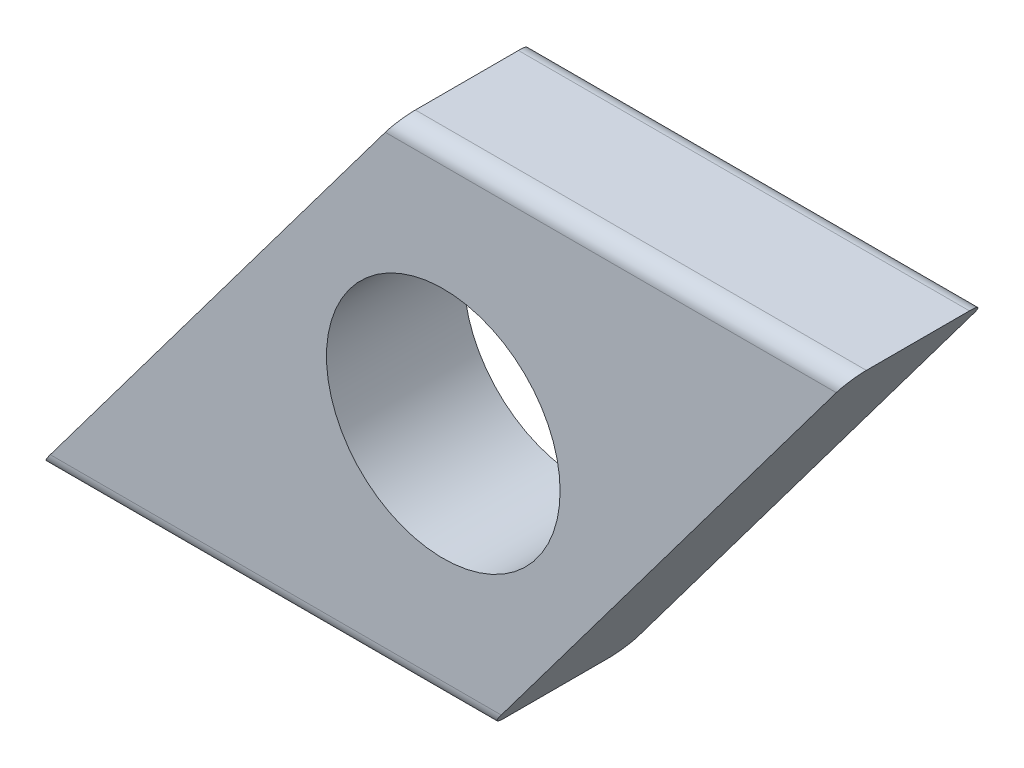
ISO-10303-21;
HEADER;
FILE_DESCRIPTION(('STEP AP214'),'2;1');
FILE_NAME('part.step','',(''),(''),'','','');
FILE_SCHEMA(('AUTOMOTIVE_DESIGN { 1 0 10303 214 1 1 1 1 }'));
ENDSEC;
DATA;
#1=APPLICATION_CONTEXT('core data for automotive mechanical design processes');
#2=APPLICATION_PROTOCOL_DEFINITION('international standard','automotive_design',2000,#1);
#3=PRODUCT_CONTEXT('',#1,'mechanical');
#4=PRODUCT('Part','Part','',(#3));
#5=PRODUCT_RELATED_PRODUCT_CATEGORY('part','',(#4));
#6=PRODUCT_DEFINITION_FORMATION('','',#4);
#7=PRODUCT_DEFINITION_CONTEXT('part definition',#1,'design');
#8=PRODUCT_DEFINITION('design','',#6,#7);
#9=PRODUCT_DEFINITION_SHAPE('','',#8);
#10=(LENGTH_UNIT() NAMED_UNIT(*) SI_UNIT(.MILLI.,.METRE.));
#11=(NAMED_UNIT(*) PLANE_ANGLE_UNIT() SI_UNIT($,.RADIAN.));
#12=(NAMED_UNIT(*) SI_UNIT($,.STERADIAN.) SOLID_ANGLE_UNIT());
#13=UNCERTAINTY_MEASURE_WITH_UNIT(LENGTH_MEASURE(1.E-05),#10,'distance_accuracy_value','');
#14=(GEOMETRIC_REPRESENTATION_CONTEXT(3) GLOBAL_UNCERTAINTY_ASSIGNED_CONTEXT((#13)) GLOBAL_UNIT_ASSIGNED_CONTEXT((#10,
#11,#12)) REPRESENTATION_CONTEXT('',''));
#15=CARTESIAN_POINT('',(0.,0.,0.));
#16=DIRECTION('',(0.,0.,1.));
#17=DIRECTION('',(1.,0.,0.));
#18=AXIS2_PLACEMENT_3D('',#15,#16,#17);
#19=CARTESIAN_POINT('',(23.6250000000003,14.,4.));
#20=DIRECTION('',(0.,-1.,0.));
#21=DIRECTION('',(0.,0.,-1.));
#22=AXIS2_PLACEMENT_3D('',#19,#20,#21);
#23=PLANE('',#22);
#24=DIRECTION('',(0.,0.,-1.));
#25=VECTOR('',#24,1.);
#26=CARTESIAN_POINT('',(23.6250000000003,14.,4.));
#27=LINE('',#26,#25);
#28=CARTESIAN_POINT('',(23.6250000000003,14.,3.5));
#29=VERTEX_POINT('',#28);
#30=CARTESIAN_POINT('',(23.6250000000003,14.,0.5));
#31=VERTEX_POINT('',#30);
#32=EDGE_CURVE('E166',#29,#31,#27,.T.);
#33=ORIENTED_EDGE('',*,*,#32,.T.);
#34=DIRECTION('',(-1.,0.,0.));
#35=VECTOR('',#34,1.);
#36=CARTESIAN_POINT('',(23.6250000000003,14.,0.5));
#37=LINE('',#36,#35);
#38=CARTESIAN_POINT('',(10.5000000000001,14.,0.5));
#39=VERTEX_POINT('',#38);
#40=EDGE_CURVE('E122',#31,#39,#37,.T.);
#41=ORIENTED_EDGE('',*,*,#40,.T.);
#42=DIRECTION('',(0.,0.,-1.));
#43=VECTOR('',#42,1.);
#44=CARTESIAN_POINT('',(10.5000000000001,14.,4.));
#45=LINE('',#44,#43);
#46=CARTESIAN_POINT('',(10.5000000000001,14.,3.5));
#47=VERTEX_POINT('',#46);
#48=EDGE_CURVE('E106',#47,#39,#45,.T.);
#49=ORIENTED_EDGE('',*,*,#48,.F.);
#50=DIRECTION('',(-1.,0.,0.));
#51=VECTOR('',#50,1.);
#52=CARTESIAN_POINT('',(23.6250000000003,14.,3.5));
#53=LINE('',#52,#51);
#54=EDGE_CURVE('E119',#47,#29,#53,.F.);
#55=ORIENTED_EDGE('',*,*,#54,.T.);
#56=EDGE_LOOP('',(#33,#41,#49,#55));
#57=FACE_BOUND('',#56,.T.);
#58=ADVANCED_FACE('F37',(#57),#23,.F.);
#59=CARTESIAN_POINT('',(10.5000000000001,14.,4.));
#60=DIRECTION('',(0.8,-0.6,0.));
#61=DIRECTION('',(0.6,0.8,0.));
#62=AXIS2_PLACEMENT_3D('',#59,#60,#61);
#63=PLANE('',#62);
#64=ORIENTED_EDGE('',*,*,#48,.T.);
#65=CARTESIAN_POINT('',(10.1250000000001,13.5,0.5));
#66=DIRECTION('',(0.8,-0.6,0.));
#67=DIRECTION('',(-0.6,-0.8,0.));
#68=AXIS2_PLACEMENT_3D('',#65,#66,#67);
#69=ELLIPSE('',#68,0.625,0.5);
#70=CARTESIAN_POINT('',(10.1250000000001,13.5,0.));
#71=VERTEX_POINT('',#70);
#72=EDGE_CURVE('E113',#39,#71,#69,.F.);
#73=ORIENTED_EDGE('',*,*,#72,.T.);
#74=DIRECTION('',(-0.6,-0.8,0.));
#75=VECTOR('',#74,1.);
#76=CARTESIAN_POINT('',(10.5000000000001,14.,0.));
#77=LINE('',#76,#75);
#78=CARTESIAN_POINT('',(0.375000000000058,0.499999999999999,0.));
#79=VERTEX_POINT('',#78);
#80=EDGE_CURVE('E173',#71,#79,#77,.T.);
#81=ORIENTED_EDGE('',*,*,#80,.T.);
#82=CARTESIAN_POINT('',(0.375000000000059,0.5,0.5));
#83=DIRECTION('',(0.8,-0.6,0.));
#84=DIRECTION('',(0.6,0.8,0.));
#85=AXIS2_PLACEMENT_3D('',#82,#83,#84);
#86=ELLIPSE('',#85,0.625,0.5);
#87=CARTESIAN_POINT('',(0.,0.,0.5));
#88=VERTEX_POINT('',#87);
#89=EDGE_CURVE('E114',#79,#88,#86,.F.);
#90=ORIENTED_EDGE('',*,*,#89,.T.);
#91=DIRECTION('',(0.,0.,-1.));
#92=VECTOR('',#91,1.);
#93=CARTESIAN_POINT('',(0.,0.,4.));
#94=LINE('',#93,#92);
#95=CARTESIAN_POINT('',(0.,0.,3.5));
#96=VERTEX_POINT('',#95);
#97=EDGE_CURVE('E123',#96,#88,#94,.T.);
#98=ORIENTED_EDGE('',*,*,#97,.F.);
#99=CARTESIAN_POINT('',(0.375000000000058,0.5,3.5));
#100=DIRECTION('',(0.8,-0.6,0.));
#101=DIRECTION('',(-0.6,-0.8,0.));
#102=AXIS2_PLACEMENT_3D('',#99,#100,#101);
#103=ELLIPSE('',#102,0.625,0.5);
#104=CARTESIAN_POINT('',(0.375000000000058,0.499999999999999,4.));
#105=VERTEX_POINT('',#104);
#106=EDGE_CURVE('E129',#96,#105,#103,.F.);
#107=ORIENTED_EDGE('',*,*,#106,.T.);
#108=DIRECTION('',(-0.6,-0.8,0.));
#109=VECTOR('',#108,1.);
#110=CARTESIAN_POINT('',(10.5000000000001,14.,4.));
#111=LINE('',#110,#109);
#112=CARTESIAN_POINT('',(10.1250000000001,13.5,4.));
#113=VERTEX_POINT('',#112);
#114=EDGE_CURVE('E108',#113,#105,#111,.T.);
#115=ORIENTED_EDGE('',*,*,#114,.F.);
#116=CARTESIAN_POINT('',(10.1250000000001,13.5,3.5));
#117=DIRECTION('',(0.8,-0.6,0.));
#118=DIRECTION('',(0.6,0.8,0.));
#119=AXIS2_PLACEMENT_3D('',#116,#117,#118);
#120=ELLIPSE('',#119,0.625,0.5);
#121=EDGE_CURVE('E103',#113,#47,#120,.F.);
#122=ORIENTED_EDGE('',*,*,#121,.T.);
#123=EDGE_LOOP('',(#64,#73,#81,#90,#98,#107,#115,#122));
#124=FACE_BOUND('',#123,.T.);
#125=ADVANCED_FACE('F105',(#124),#63,.F.);
#126=CARTESIAN_POINT('',(0.,0.,4.));
#127=DIRECTION('',(0.,1.,0.));
#128=DIRECTION('',(0.,0.,1.));
#129=AXIS2_PLACEMENT_3D('',#126,#127,#128);
#130=PLANE('',#129);
#131=ORIENTED_EDGE('',*,*,#97,.T.);
#132=DIRECTION('',(1.,0.,0.));
#133=VECTOR('',#132,1.);
#134=CARTESIAN_POINT('',(0.,0.,0.5));
#135=LINE('',#134,#133);
#136=CARTESIAN_POINT('',(13.1249999999998,0.,0.5));
#137=VERTEX_POINT('',#136);
#138=EDGE_CURVE('E11',#88,#137,#135,.T.);
#139=ORIENTED_EDGE('',*,*,#138,.T.);
#140=DIRECTION('',(0.,0.,-1.));
#141=VECTOR('',#140,1.);
#142=CARTESIAN_POINT('',(13.1249999999998,0.,4.));
#143=LINE('',#142,#141);
#144=CARTESIAN_POINT('',(13.1249999999998,0.,3.5));
#145=VERTEX_POINT('',#144);
#146=EDGE_CURVE('E154',#145,#137,#143,.T.);
#147=ORIENTED_EDGE('',*,*,#146,.F.);
#148=DIRECTION('',(1.,0.,0.));
#149=VECTOR('',#148,1.);
#150=CARTESIAN_POINT('',(0.,0.,3.5));
#151=LINE('',#150,#149);
#152=EDGE_CURVE('E45',#145,#96,#151,.F.);
#153=ORIENTED_EDGE('',*,*,#152,.T.);
#154=EDGE_LOOP('',(#131,#139,#147,#153));
#155=FACE_BOUND('',#154,.T.);
#156=ADVANCED_FACE('F153',(#155),#130,.F.);
#157=CARTESIAN_POINT('',(13.1249999999998,0.,4.));
#158=DIRECTION('',(-0.799999999999988,0.600000000000017,0.));
#159=DIRECTION('',(-0.600000000000017,-0.799999999999988,0.));
#160=AXIS2_PLACEMENT_3D('',#157,#158,#159);
#161=PLANE('',#160);
#162=DIRECTION('',(0.600000000000017,0.799999999999987,0.));
#163=VECTOR('',#162,1.);
#164=CARTESIAN_POINT('',(13.1249999999998,0.,0.));
#165=LINE('',#164,#163);
#166=CARTESIAN_POINT('',(13.4999999999998,0.5,0.));
#167=VERTEX_POINT('',#166);
#168=CARTESIAN_POINT('',(23.2500000000003,13.5,0.));
#169=VERTEX_POINT('',#168);
#170=EDGE_CURVE('E169',#167,#169,#165,.T.);
#171=ORIENTED_EDGE('',*,*,#170,.T.);
#172=CARTESIAN_POINT('',(23.2500000000003,13.5,0.5));
#173=DIRECTION('',(-0.799999999999988,0.600000000000017,0.));
#174=DIRECTION('',(-0.600000000000017,-0.799999999999988,0.));
#175=AXIS2_PLACEMENT_3D('',#172,#173,#174);
#176=ELLIPSE('',#175,0.62500000000001,0.5);
#177=EDGE_CURVE('E143',#169,#31,#176,.F.);
#178=ORIENTED_EDGE('',*,*,#177,.T.);
#179=ORIENTED_EDGE('',*,*,#32,.F.);
#180=CARTESIAN_POINT('',(23.2500000000003,13.5,3.5));
#181=DIRECTION('',(-0.799999999999988,0.600000000000017,0.));
#182=DIRECTION('',(0.600000000000017,0.799999999999988,0.));
#183=AXIS2_PLACEMENT_3D('',#180,#181,#182);
#184=ELLIPSE('',#183,0.62500000000001,0.5);
#185=CARTESIAN_POINT('',(23.2500000000003,13.5,4.));
#186=VERTEX_POINT('',#185);
#187=EDGE_CURVE('E127',#29,#186,#184,.F.);
#188=ORIENTED_EDGE('',*,*,#187,.T.);
#189=DIRECTION('',(0.600000000000017,0.799999999999987,0.));
#190=VECTOR('',#189,1.);
#191=CARTESIAN_POINT('',(13.1249999999998,0.,4.));
#192=LINE('',#191,#190);
#193=CARTESIAN_POINT('',(13.4999999999998,0.5,4.));
#194=VERTEX_POINT('',#193);
#195=EDGE_CURVE('E163',#194,#186,#192,.T.);
#196=ORIENTED_EDGE('',*,*,#195,.F.);
#197=CARTESIAN_POINT('',(13.4999999999998,0.5,3.5));
#198=DIRECTION('',(-0.799999999999988,0.600000000000017,0.));
#199=DIRECTION('',(-0.600000000000017,-0.799999999999988,0.));
#200=AXIS2_PLACEMENT_3D('',#197,#198,#199);
#201=ELLIPSE('',#200,0.62500000000001,0.5);
#202=EDGE_CURVE('E59',#194,#145,#201,.F.);
#203=ORIENTED_EDGE('',*,*,#202,.T.);
#204=ORIENTED_EDGE('',*,*,#146,.T.);
#205=CARTESIAN_POINT('',(13.4999999999998,0.5,0.5));
#206=DIRECTION('',(-0.799999999999988,0.600000000000017,0.));
#207=DIRECTION('',(0.600000000000017,0.799999999999988,0.));
#208=AXIS2_PLACEMENT_3D('',#205,#206,#207);
#209=ELLIPSE('',#208,0.62500000000001,0.5);
#210=EDGE_CURVE('E52',#137,#167,#209,.F.);
#211=ORIENTED_EDGE('',*,*,#210,.T.);
#212=EDGE_LOOP('',(#171,#178,#179,#188,#196,#203,#204,#211));
#213=FACE_BOUND('',#212,.T.);
#214=ADVANCED_FACE('F165',(#213),#161,.F.);
#215=CARTESIAN_POINT('',(0.,0.,4.));
#216=DIRECTION('',(0.,0.,1.));
#217=DIRECTION('',(1.,0.,0.));
#218=AXIS2_PLACEMENT_3D('',#215,#216,#217);
#219=PLANE('',#218);
#220=CARTESIAN_POINT('',(11.8125000000001,7.,4.));
#221=DIRECTION('',(0.,0.,1.));
#222=DIRECTION('',(1.,0.,0.));
#223=AXIS2_PLACEMENT_3D('',#220,#221,#222);
#224=CIRCLE('',#223,3.39999999999999);
#225=CARTESIAN_POINT('',(15.2125,7.,4.));
#226=VERTEX_POINT('',#225);
#227=EDGE_CURVE('E281',#226,#226,#224,.T.);
#228=ORIENTED_EDGE('',*,*,#227,.F.);
#229=EDGE_LOOP('',(#228));
#230=FACE_BOUND('',#229,.T.);
#231=ORIENTED_EDGE('',*,*,#195,.T.);
#232=DIRECTION('',(-1.,0.,0.));
#233=VECTOR('',#232,1.);
#234=CARTESIAN_POINT('',(10.5000000000001,13.5,4.));
#235=LINE('',#234,#233);
#236=EDGE_CURVE('E148',#186,#113,#235,.T.);
#237=ORIENTED_EDGE('',*,*,#236,.T.);
#238=ORIENTED_EDGE('',*,*,#114,.T.);
#239=DIRECTION('',(1.,0.,0.));
#240=VECTOR('',#239,1.);
#241=CARTESIAN_POINT('',(13.1249999999998,0.5,4.));
#242=LINE('',#241,#240);
#243=EDGE_CURVE('E145',#105,#194,#242,.T.);
#244=ORIENTED_EDGE('',*,*,#243,.T.);
#245=EDGE_LOOP('',(#231,#237,#238,#244));
#246=FACE_BOUND('',#245,.T.);
#247=ADVANCED_FACE('F162',(#230,#246),#219,.T.);
#248=CARTESIAN_POINT('',(0.,0.,0.));
#249=DIRECTION('',(0.,0.,1.));
#250=DIRECTION('',(1.,0.,0.));
#251=AXIS2_PLACEMENT_3D('',#248,#249,#250);
#252=PLANE('',#251);
#253=CARTESIAN_POINT('',(11.8125000000001,7.,0.));
#254=DIRECTION('',(0.,0.,1.));
#255=DIRECTION('',(1.,0.,0.));
#256=AXIS2_PLACEMENT_3D('',#253,#254,#255);
#257=CIRCLE('',#256,3.39999999999999);
#258=CARTESIAN_POINT('',(15.2125,7.,0.));
#259=VERTEX_POINT('',#258);
#260=EDGE_CURVE('E175',#259,#259,#257,.T.);
#261=ORIENTED_EDGE('',*,*,#260,.T.);
#262=EDGE_LOOP('',(#261));
#263=FACE_BOUND('',#262,.T.);
#264=ORIENTED_EDGE('',*,*,#80,.F.);
#265=DIRECTION('',(-1.,0.,0.));
#266=VECTOR('',#265,1.);
#267=CARTESIAN_POINT('',(0.,13.5,0.));
#268=LINE('',#267,#266);
#269=EDGE_CURVE('E138',#71,#169,#268,.F.);
#270=ORIENTED_EDGE('',*,*,#269,.T.);
#271=ORIENTED_EDGE('',*,*,#170,.F.);
#272=DIRECTION('',(1.,0.,0.));
#273=VECTOR('',#272,1.);
#274=CARTESIAN_POINT('',(0.,0.5,0.));
#275=LINE('',#274,#273);
#276=EDGE_CURVE('E136',#167,#79,#275,.F.);
#277=ORIENTED_EDGE('',*,*,#276,.T.);
#278=EDGE_LOOP('',(#264,#270,#271,#277));
#279=FACE_BOUND('',#278,.T.);
#280=ADVANCED_FACE('F181',(#263,#279),#252,.F.);
#281=CARTESIAN_POINT('',(11.8125000000001,7.,4.));
#282=DIRECTION('',(0.,0.,1.));
#283=DIRECTION('',(1.,0.,0.));
#284=AXIS2_PLACEMENT_3D('',#281,#282,#283);
#285=CYLINDRICAL_SURFACE('',#284,3.39999999999999);
#286=ORIENTED_EDGE('',*,*,#227,.T.);
#287=EDGE_LOOP('',(#286));
#288=FACE_BOUND('',#287,.T.);
#289=ORIENTED_EDGE('',*,*,#260,.F.);
#290=EDGE_LOOP('',(#289));
#291=FACE_BOUND('',#290,.T.);
#292=ADVANCED_FACE('F200',(#288,#291),#285,.F.);
#293=CARTESIAN_POINT('',(23.6250000000003,13.5,0.5));
#294=DIRECTION('',(-1.,0.,0.));
#295=DIRECTION('',(0.,0.,1.));
#296=AXIS2_PLACEMENT_3D('',#293,#294,#295);
#297=CYLINDRICAL_SURFACE('',#296,0.5);
#298=ORIENTED_EDGE('',*,*,#177,.F.);
#299=ORIENTED_EDGE('',*,*,#269,.F.);
#300=ORIENTED_EDGE('',*,*,#72,.F.);
#301=ORIENTED_EDGE('',*,*,#40,.F.);
#302=EDGE_LOOP('',(#298,#299,#300,#301));
#303=FACE_BOUND('',#302,.T.);
#304=ADVANCED_FACE('F189',(#303),#297,.T.);
#305=CARTESIAN_POINT('',(0.,13.5,3.5));
#306=DIRECTION('',(1.,0.,0.));
#307=DIRECTION('',(0.,0.,-1.));
#308=AXIS2_PLACEMENT_3D('',#305,#306,#307);
#309=CYLINDRICAL_SURFACE('',#308,0.5);
#310=ORIENTED_EDGE('',*,*,#187,.F.);
#311=ORIENTED_EDGE('',*,*,#54,.F.);
#312=ORIENTED_EDGE('',*,*,#121,.F.);
#313=ORIENTED_EDGE('',*,*,#236,.F.);
#314=EDGE_LOOP('',(#310,#311,#312,#313));
#315=FACE_BOUND('',#314,.T.);
#316=ADVANCED_FACE('F126',(#315),#309,.T.);
#317=CARTESIAN_POINT('',(0.,0.5,0.5));
#318=DIRECTION('',(1.,0.,0.));
#319=DIRECTION('',(0.,0.,-1.));
#320=AXIS2_PLACEMENT_3D('',#317,#318,#319);
#321=CYLINDRICAL_SURFACE('',#320,0.5);
#322=ORIENTED_EDGE('',*,*,#89,.F.);
#323=ORIENTED_EDGE('',*,*,#276,.F.);
#324=ORIENTED_EDGE('',*,*,#210,.F.);
#325=ORIENTED_EDGE('',*,*,#138,.F.);
#326=EDGE_LOOP('',(#322,#323,#324,#325));
#327=FACE_BOUND('',#326,.T.);
#328=ADVANCED_FACE('F183',(#327),#321,.T.);
#329=CARTESIAN_POINT('',(0.,0.5,3.5));
#330=DIRECTION('',(-1.,0.,0.));
#331=DIRECTION('',(0.,0.,1.));
#332=AXIS2_PLACEMENT_3D('',#329,#330,#331);
#333=CYLINDRICAL_SURFACE('',#332,0.5);
#334=ORIENTED_EDGE('',*,*,#106,.F.);
#335=ORIENTED_EDGE('',*,*,#152,.F.);
#336=ORIENTED_EDGE('',*,*,#202,.F.);
#337=ORIENTED_EDGE('',*,*,#243,.F.);
#338=EDGE_LOOP('',(#334,#335,#336,#337));
#339=FACE_BOUND('',#338,.T.);
#340=ADVANCED_FACE('F39',(#339),#333,.T.);
#341=CLOSED_SHELL('',(#58,#125,#156,#214,#247,#280,#292,#304,#316,#328,#340));
#342=MANIFOLD_SOLID_BREP('B2',#341);
#343=ADVANCED_BREP_SHAPE_REPRESENTATION('',(#18,#342),#14);
#344=SHAPE_DEFINITION_REPRESENTATION(#9,#343);
ENDSEC;
END-ISO-10303-21;
